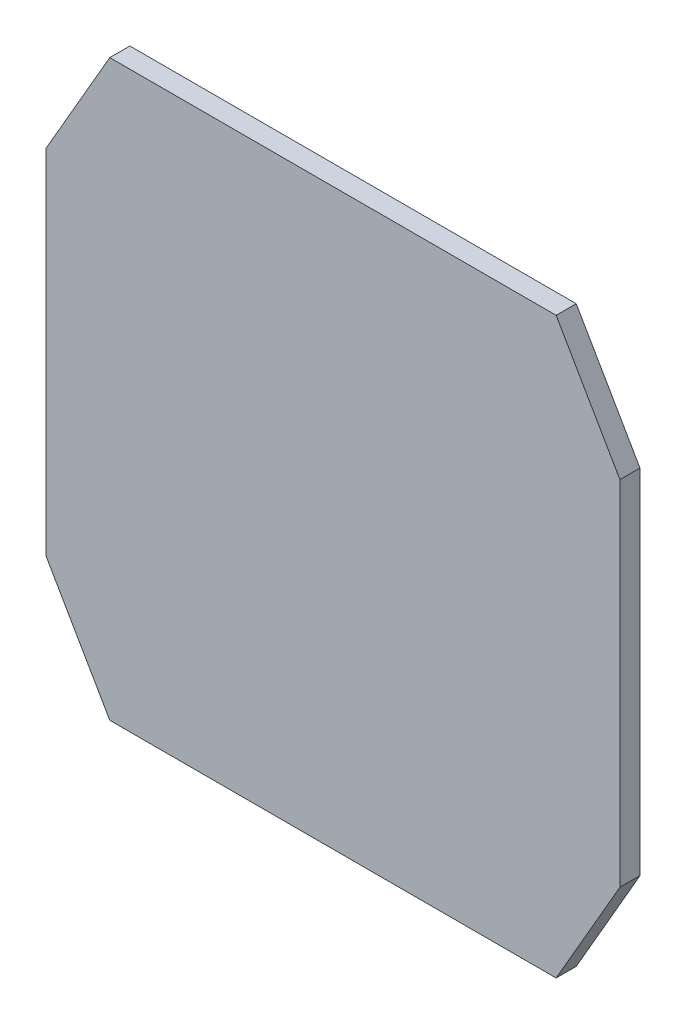
ISO-10303-21;
HEADER;
FILE_DESCRIPTION(('STEP AP214'),'2;1');
FILE_NAME('part.step','',(''),(''),'','','');
FILE_SCHEMA(('AUTOMOTIVE_DESIGN { 1 0 10303 214 1 1 1 1 }'));
ENDSEC;
DATA;
#1=APPLICATION_CONTEXT('core data for automotive mechanical design processes');
#2=APPLICATION_PROTOCOL_DEFINITION('international standard','automotive_design',2000,#1);
#3=PRODUCT_CONTEXT('',#1,'mechanical');
#4=PRODUCT('Part','Part','',(#3));
#5=PRODUCT_RELATED_PRODUCT_CATEGORY('part','',(#4));
#6=PRODUCT_DEFINITION_FORMATION('','',#4);
#7=PRODUCT_DEFINITION_CONTEXT('part definition',#1,'design');
#8=PRODUCT_DEFINITION('design','',#6,#7);
#9=PRODUCT_DEFINITION_SHAPE('','',#8);
#10=(LENGTH_UNIT() NAMED_UNIT(*) SI_UNIT(.MILLI.,.METRE.));
#11=(NAMED_UNIT(*) PLANE_ANGLE_UNIT() SI_UNIT($,.RADIAN.));
#12=(NAMED_UNIT(*) SI_UNIT($,.STERADIAN.) SOLID_ANGLE_UNIT());
#13=UNCERTAINTY_MEASURE_WITH_UNIT(LENGTH_MEASURE(1.E-05),#10,'distance_accuracy_value','');
#14=(GEOMETRIC_REPRESENTATION_CONTEXT(3) GLOBAL_UNCERTAINTY_ASSIGNED_CONTEXT((#13)) GLOBAL_UNIT_ASSIGNED_CONTEXT((#10,
#11,#12)) REPRESENTATION_CONTEXT('',''));
#15=CARTESIAN_POINT('',(0.,0.,0.));
#16=DIRECTION('',(0.,0.,1.));
#17=DIRECTION('',(1.,0.,0.));
#18=AXIS2_PLACEMENT_3D('',#15,#16,#17);
#19=CARTESIAN_POINT('',(450.,-450.,31.5));
#20=DIRECTION('',(-1.,0.,0.));
#21=DIRECTION('',(0.,0.,1.));
#22=AXIS2_PLACEMENT_3D('',#19,#20,#21);
#23=PLANE('',#22);
#24=DIRECTION('',(0.,1.,0.));
#25=VECTOR('',#24,1.);
#26=CARTESIAN_POINT('',(450.,-450.,0.));
#27=LINE('',#26,#25);
#28=CARTESIAN_POINT('',(450.,-276.794919243113,0.));
#29=VERTEX_POINT('',#28);
#30=CARTESIAN_POINT('',(450.,276.794919243112,0.));
#31=VERTEX_POINT('',#30);
#32=EDGE_CURVE('E122',#29,#31,#27,.T.);
#33=ORIENTED_EDGE('',*,*,#32,.T.);
#34=DIRECTION('',(0.,0.,1.));
#35=VECTOR('',#34,1.);
#36=CARTESIAN_POINT('',(450.,276.794919243112,31.5));
#37=LINE('',#36,#35);
#38=CARTESIAN_POINT('',(450.,276.794919243112,31.5));
#39=VERTEX_POINT('',#38);
#40=EDGE_CURVE('E11',#31,#39,#37,.T.);
#41=ORIENTED_EDGE('',*,*,#40,.T.);
#42=DIRECTION('',(0.,1.,0.));
#43=VECTOR('',#42,1.);
#44=CARTESIAN_POINT('',(450.,-450.,31.5));
#45=LINE('',#44,#43);
#46=CARTESIAN_POINT('',(450.,-276.794919243113,31.5));
#47=VERTEX_POINT('',#46);
#48=EDGE_CURVE('E123',#47,#39,#45,.T.);
#49=ORIENTED_EDGE('',*,*,#48,.F.);
#50=DIRECTION('',(0.,0.,-1.));
#51=VECTOR('',#50,1.);
#52=CARTESIAN_POINT('',(450.,-276.794919243113,31.5));
#53=LINE('',#52,#51);
#54=EDGE_CURVE('E113',#47,#29,#53,.T.);
#55=ORIENTED_EDGE('',*,*,#54,.T.);
#56=EDGE_LOOP('',(#33,#41,#49,#55));
#57=FACE_BOUND('',#56,.T.);
#58=ADVANCED_FACE('F41',(#57),#23,.F.);
#59=CARTESIAN_POINT('',(-450.,450.,31.5));
#60=DIRECTION('',(0.,-1.,0.));
#61=DIRECTION('',(0.,0.,-1.));
#62=AXIS2_PLACEMENT_3D('',#59,#60,#61);
#63=PLANE('',#62);
#64=DIRECTION('',(-1.,0.,0.));
#65=VECTOR('',#64,1.);
#66=CARTESIAN_POINT('',(-450.,450.,31.5));
#67=LINE('',#66,#65);
#68=CARTESIAN_POINT('',(350.,450.,31.5));
#69=VERTEX_POINT('',#68);
#70=CARTESIAN_POINT('',(-350.,450.,31.5));
#71=VERTEX_POINT('',#70);
#72=EDGE_CURVE('E185',#69,#71,#67,.T.);
#73=ORIENTED_EDGE('',*,*,#72,.F.);
#74=DIRECTION('',(0.,0.,-1.));
#75=VECTOR('',#74,1.);
#76=CARTESIAN_POINT('',(350.,450.,31.5));
#77=LINE('',#76,#75);
#78=CARTESIAN_POINT('',(350.,450.,0.));
#79=VERTEX_POINT('',#78);
#80=EDGE_CURVE('E51',#69,#79,#77,.T.);
#81=ORIENTED_EDGE('',*,*,#80,.T.);
#82=DIRECTION('',(-1.,0.,0.));
#83=VECTOR('',#82,1.);
#84=CARTESIAN_POINT('',(-450.,450.,0.));
#85=LINE('',#84,#83);
#86=CARTESIAN_POINT('',(-350.,450.,0.));
#87=VERTEX_POINT('',#86);
#88=EDGE_CURVE('E131',#79,#87,#85,.T.);
#89=ORIENTED_EDGE('',*,*,#88,.T.);
#90=DIRECTION('',(0.,0.,1.));
#91=VECTOR('',#90,1.);
#92=CARTESIAN_POINT('',(-350.,450.,31.5));
#93=LINE('',#92,#91);
#94=EDGE_CURVE('E160',#87,#71,#93,.T.);
#95=ORIENTED_EDGE('',*,*,#94,.T.);
#96=EDGE_LOOP('',(#73,#81,#89,#95));
#97=FACE_BOUND('',#96,.T.);
#98=ADVANCED_FACE('F184',(#97),#63,.F.);
#99=CARTESIAN_POINT('',(-450.,-450.,31.5));
#100=DIRECTION('',(1.,0.,0.));
#101=DIRECTION('',(0.,0.,-1.));
#102=AXIS2_PLACEMENT_3D('',#99,#100,#101);
#103=PLANE('',#102);
#104=DIRECTION('',(0.,-1.,0.));
#105=VECTOR('',#104,1.);
#106=CARTESIAN_POINT('',(-450.,-450.,0.));
#107=LINE('',#106,#105);
#108=CARTESIAN_POINT('',(-450.,276.794919243112,0.));
#109=VERTEX_POINT('',#108);
#110=CARTESIAN_POINT('',(-450.,-276.794919243113,0.));
#111=VERTEX_POINT('',#110);
#112=EDGE_CURVE('E134',#109,#111,#107,.T.);
#113=ORIENTED_EDGE('',*,*,#112,.T.);
#114=DIRECTION('',(0.,0.,1.));
#115=VECTOR('',#114,1.);
#116=CARTESIAN_POINT('',(-450.,-276.794919243113,31.5));
#117=LINE('',#116,#115);
#118=CARTESIAN_POINT('',(-450.,-276.794919243113,31.5));
#119=VERTEX_POINT('',#118);
#120=EDGE_CURVE('E173',#111,#119,#117,.T.);
#121=ORIENTED_EDGE('',*,*,#120,.T.);
#122=DIRECTION('',(0.,-1.,0.));
#123=VECTOR('',#122,1.);
#124=CARTESIAN_POINT('',(-450.,-450.,31.5));
#125=LINE('',#124,#123);
#126=CARTESIAN_POINT('',(-450.,276.794919243112,31.5));
#127=VERTEX_POINT('',#126);
#128=EDGE_CURVE('E196',#127,#119,#125,.T.);
#129=ORIENTED_EDGE('',*,*,#128,.F.);
#130=DIRECTION('',(0.,0.,-1.));
#131=VECTOR('',#130,1.);
#132=CARTESIAN_POINT('',(-450.,276.794919243112,31.5));
#133=LINE('',#132,#131);
#134=EDGE_CURVE('E156',#127,#109,#133,.T.);
#135=ORIENTED_EDGE('',*,*,#134,.T.);
#136=EDGE_LOOP('',(#113,#121,#129,#135));
#137=FACE_BOUND('',#136,.T.);
#138=ADVANCED_FACE('F199',(#137),#103,.F.);
#139=CARTESIAN_POINT('',(-450.,-450.,31.5));
#140=DIRECTION('',(0.,1.,0.));
#141=DIRECTION('',(0.,0.,1.));
#142=AXIS2_PLACEMENT_3D('',#139,#140,#141);
#143=PLANE('',#142);
#144=DIRECTION('',(1.,0.,0.));
#145=VECTOR('',#144,1.);
#146=CARTESIAN_POINT('',(-450.,-450.,31.5));
#147=LINE('',#146,#145);
#148=CARTESIAN_POINT('',(-350.,-450.,31.5));
#149=VERTEX_POINT('',#148);
#150=CARTESIAN_POINT('',(350.,-450.,31.5));
#151=VERTEX_POINT('',#150);
#152=EDGE_CURVE('E125',#149,#151,#147,.T.);
#153=ORIENTED_EDGE('',*,*,#152,.F.);
#154=DIRECTION('',(0.,0.,-1.));
#155=VECTOR('',#154,1.);
#156=CARTESIAN_POINT('',(-350.,-450.,31.5));
#157=LINE('',#156,#155);
#158=CARTESIAN_POINT('',(-350.,-450.,0.));
#159=VERTEX_POINT('',#158);
#160=EDGE_CURVE('E164',#149,#159,#157,.T.);
#161=ORIENTED_EDGE('',*,*,#160,.T.);
#162=DIRECTION('',(1.,0.,0.));
#163=VECTOR('',#162,1.);
#164=CARTESIAN_POINT('',(-450.,-450.,0.));
#165=LINE('',#164,#163);
#166=CARTESIAN_POINT('',(350.,-450.,0.));
#167=VERTEX_POINT('',#166);
#168=EDGE_CURVE('E142',#159,#167,#165,.T.);
#169=ORIENTED_EDGE('',*,*,#168,.T.);
#170=DIRECTION('',(0.,0.,1.));
#171=VECTOR('',#170,1.);
#172=CARTESIAN_POINT('',(350.,-450.,31.5));
#173=LINE('',#172,#171);
#174=EDGE_CURVE('E115',#167,#151,#173,.T.);
#175=ORIENTED_EDGE('',*,*,#174,.T.);
#176=EDGE_LOOP('',(#153,#161,#169,#175));
#177=FACE_BOUND('',#176,.T.);
#178=ADVANCED_FACE('F265',(#177),#143,.F.);
#179=CARTESIAN_POINT('',(0.,0.,31.5));
#180=DIRECTION('',(0.,0.,-1.));
#181=DIRECTION('',(-1.,0.,0.));
#182=AXIS2_PLACEMENT_3D('',#179,#180,#181);
#183=PLANE('',#182);
#184=ORIENTED_EDGE('',*,*,#128,.T.);
#185=DIRECTION('',(-0.500000000000001,0.866025403784438,0.));
#186=VECTOR('',#185,1.);
#187=CARTESIAN_POINT('',(-350.,-450.,31.5));
#188=LINE('',#187,#186);
#189=EDGE_CURVE('E178',#119,#149,#188,.F.);
#190=ORIENTED_EDGE('',*,*,#189,.T.);
#191=ORIENTED_EDGE('',*,*,#152,.T.);
#192=DIRECTION('',(-0.500000000000001,-0.866025403784438,0.));
#193=VECTOR('',#192,1.);
#194=CARTESIAN_POINT('',(450.,-276.794919243113,31.5));
#195=LINE('',#194,#193);
#196=EDGE_CURVE('E153',#151,#47,#195,.F.);
#197=ORIENTED_EDGE('',*,*,#196,.T.);
#198=ORIENTED_EDGE('',*,*,#48,.T.);
#199=DIRECTION('',(0.500000000000001,-0.866025403784438,0.));
#200=VECTOR('',#199,1.);
#201=CARTESIAN_POINT('',(350.,450.,31.5));
#202=LINE('',#201,#200);
#203=EDGE_CURVE('E58',#39,#69,#202,.F.);
#204=ORIENTED_EDGE('',*,*,#203,.T.);
#205=ORIENTED_EDGE('',*,*,#72,.T.);
#206=DIRECTION('',(0.500000000000001,0.866025403784438,0.));
#207=VECTOR('',#206,1.);
#208=CARTESIAN_POINT('',(-450.,276.794919243112,31.5));
#209=LINE('',#208,#207);
#210=EDGE_CURVE('E150',#71,#127,#209,.F.);
#211=ORIENTED_EDGE('',*,*,#210,.T.);
#212=EDGE_LOOP('',(#184,#190,#191,#197,#198,#204,#205,#211));
#213=FACE_BOUND('',#212,.T.);
#214=ADVANCED_FACE('F195',(#213),#183,.F.);
#215=CARTESIAN_POINT('',(0.,0.,0.));
#216=DIRECTION('',(0.,0.,-1.));
#217=DIRECTION('',(-1.,0.,0.));
#218=AXIS2_PLACEMENT_3D('',#215,#216,#217);
#219=PLANE('',#218);
#220=ORIENTED_EDGE('',*,*,#168,.F.);
#221=DIRECTION('',(0.500000000000001,-0.866025403784438,0.));
#222=VECTOR('',#221,1.);
#223=CARTESIAN_POINT('',(-457.355715851499,-264.054445662277,0.));
#224=LINE('',#223,#222);
#225=EDGE_CURVE('E170',#159,#111,#224,.F.);
#226=ORIENTED_EDGE('',*,*,#225,.T.);
#227=ORIENTED_EDGE('',*,*,#112,.F.);
#228=DIRECTION('',(-0.500000000000001,-0.866025403784438,0.));
#229=VECTOR('',#228,1.);
#230=CARTESIAN_POINT('',(-457.355715851498,264.054445662277,0.));
#231=LINE('',#230,#229);
#232=EDGE_CURVE('E120',#109,#87,#231,.F.);
#233=ORIENTED_EDGE('',*,*,#232,.T.);
#234=ORIENTED_EDGE('',*,*,#88,.F.);
#235=DIRECTION('',(-0.500000000000001,0.866025403784438,0.));
#236=VECTOR('',#235,1.);
#237=CARTESIAN_POINT('',(457.355715851498,264.054445662277,0.));
#238=LINE('',#237,#236);
#239=EDGE_CURVE('E129',#79,#31,#238,.F.);
#240=ORIENTED_EDGE('',*,*,#239,.T.);
#241=ORIENTED_EDGE('',*,*,#32,.F.);
#242=DIRECTION('',(0.500000000000001,0.866025403784438,0.));
#243=VECTOR('',#242,1.);
#244=CARTESIAN_POINT('',(457.355715851498,-264.054445662277,0.));
#245=LINE('',#244,#243);
#246=EDGE_CURVE('E109',#29,#167,#245,.F.);
#247=ORIENTED_EDGE('',*,*,#246,.T.);
#248=EDGE_LOOP('',(#220,#226,#227,#233,#234,#240,#241,#247));
#249=FACE_BOUND('',#248,.T.);
#250=ADVANCED_FACE('F127',(#249),#219,.T.);
#251=CARTESIAN_POINT('',(450.,-276.794919243113,31.5));
#252=DIRECTION('',(-0.866025403784438,0.500000000000001,0.));
#253=DIRECTION('',(0.,0.,-1.));
#254=AXIS2_PLACEMENT_3D('',#251,#252,#253);
#255=PLANE('',#254);
#256=ORIENTED_EDGE('',*,*,#196,.F.);
#257=ORIENTED_EDGE('',*,*,#174,.F.);
#258=ORIENTED_EDGE('',*,*,#246,.F.);
#259=ORIENTED_EDGE('',*,*,#54,.F.);
#260=EDGE_LOOP('',(#256,#257,#258,#259));
#261=FACE_BOUND('',#260,.T.);
#262=ADVANCED_FACE('F112',(#261),#255,.F.);
#263=CARTESIAN_POINT('',(-450.,276.794919243112,31.5));
#264=DIRECTION('',(0.866025403784438,-0.500000000000001,0.));
#265=DIRECTION('',(0.,0.,-1.));
#266=AXIS2_PLACEMENT_3D('',#263,#264,#265);
#267=PLANE('',#266);
#268=ORIENTED_EDGE('',*,*,#210,.F.);
#269=ORIENTED_EDGE('',*,*,#94,.F.);
#270=ORIENTED_EDGE('',*,*,#232,.F.);
#271=ORIENTED_EDGE('',*,*,#134,.F.);
#272=EDGE_LOOP('',(#268,#269,#270,#271));
#273=FACE_BOUND('',#272,.T.);
#274=ADVANCED_FACE('F192',(#273),#267,.F.);
#275=CARTESIAN_POINT('',(-350.,-450.,31.5));
#276=DIRECTION('',(0.866025403784438,0.500000000000001,0.));
#277=DIRECTION('',(0.,0.,-1.));
#278=AXIS2_PLACEMENT_3D('',#275,#276,#277);
#279=PLANE('',#278);
#280=ORIENTED_EDGE('',*,*,#189,.F.);
#281=ORIENTED_EDGE('',*,*,#120,.F.);
#282=ORIENTED_EDGE('',*,*,#225,.F.);
#283=ORIENTED_EDGE('',*,*,#160,.F.);
#284=EDGE_LOOP('',(#280,#281,#282,#283));
#285=FACE_BOUND('',#284,.T.);
#286=ADVANCED_FACE('F208',(#285),#279,.F.);
#287=CARTESIAN_POINT('',(350.,450.,31.5));
#288=DIRECTION('',(-0.866025403784438,-0.500000000000001,0.));
#289=DIRECTION('',(0.,0.,-1.));
#290=AXIS2_PLACEMENT_3D('',#287,#288,#289);
#291=PLANE('',#290);
#292=ORIENTED_EDGE('',*,*,#203,.F.);
#293=ORIENTED_EDGE('',*,*,#40,.F.);
#294=ORIENTED_EDGE('',*,*,#239,.F.);
#295=ORIENTED_EDGE('',*,*,#80,.F.);
#296=EDGE_LOOP('',(#292,#293,#294,#295));
#297=FACE_BOUND('',#296,.T.);
#298=ADVANCED_FACE('F44',(#297),#291,.F.);
#299=CLOSED_SHELL('',(#58,#98,#138,#178,#214,#250,#262,#274,#286,#298));
#300=MANIFOLD_SOLID_BREP('B2',#299);
#301=ADVANCED_BREP_SHAPE_REPRESENTATION('',(#18,#300),#14);
#302=SHAPE_DEFINITION_REPRESENTATION(#9,#301);
ENDSEC;
END-ISO-10303-21;
